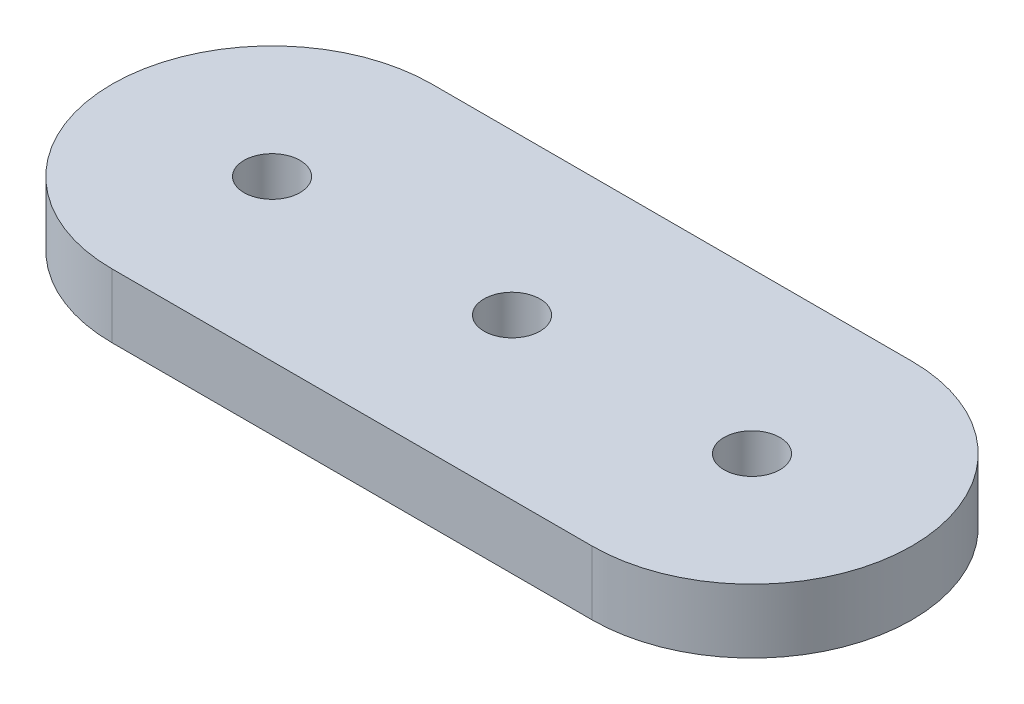
ISO-10303-21;
HEADER;
FILE_DESCRIPTION(('STEP AP214'),'2;1');
FILE_NAME('part.step','',(''),(''),'','','');
FILE_SCHEMA(('AUTOMOTIVE_DESIGN { 1 0 10303 214 1 1 1 1 }'));
ENDSEC;
DATA;
#1=APPLICATION_CONTEXT('core data for automotive mechanical design processes');
#2=APPLICATION_PROTOCOL_DEFINITION('international standard','automotive_design',2000,#1);
#3=PRODUCT_CONTEXT('',#1,'mechanical');
#4=PRODUCT('Part','Part','',(#3));
#5=PRODUCT_RELATED_PRODUCT_CATEGORY('part','',(#4));
#6=PRODUCT_DEFINITION_FORMATION('','',#4);
#7=PRODUCT_DEFINITION_CONTEXT('part definition',#1,'design');
#8=PRODUCT_DEFINITION('design','',#6,#7);
#9=PRODUCT_DEFINITION_SHAPE('','',#8);
#10=(LENGTH_UNIT() NAMED_UNIT(*) SI_UNIT(.MILLI.,.METRE.));
#11=(NAMED_UNIT(*) PLANE_ANGLE_UNIT() SI_UNIT($,.RADIAN.));
#12=(NAMED_UNIT(*) SI_UNIT($,.STERADIAN.) SOLID_ANGLE_UNIT());
#13=UNCERTAINTY_MEASURE_WITH_UNIT(LENGTH_MEASURE(1.E-05),#10,'distance_accuracy_value','');
#14=(GEOMETRIC_REPRESENTATION_CONTEXT(3) GLOBAL_UNCERTAINTY_ASSIGNED_CONTEXT((#13)) GLOBAL_UNIT_ASSIGNED_CONTEXT((#10,
#11,#12)) REPRESENTATION_CONTEXT('',''));
#15=CARTESIAN_POINT('',(0.,0.,0.));
#16=DIRECTION('',(0.,0.,1.));
#17=DIRECTION('',(1.,0.,0.));
#18=AXIS2_PLACEMENT_3D('',#15,#16,#17);
#19=CARTESIAN_POINT('',(0.,4.,0.));
#20=DIRECTION('',(0.,1.,0.));
#21=DIRECTION('',(0.,0.,1.));
#22=AXIS2_PLACEMENT_3D('',#19,#20,#21);
#23=PLANE('',#22);
#24=CARTESIAN_POINT('',(30.,4.,0.));
#25=DIRECTION('',(0.,1.,0.));
#26=DIRECTION('',(0.,0.,1.));
#27=AXIS2_PLACEMENT_3D('',#24,#25,#26);
#28=CIRCLE('',#27,1.75);
#29=CARTESIAN_POINT('',(30.,4.,1.75));
#30=VERTEX_POINT('',#29);
#31=EDGE_CURVE('E116',#30,#30,#28,.T.);
#32=ORIENTED_EDGE('',*,*,#31,.F.);
#33=EDGE_LOOP('',(#32));
#34=FACE_BOUND('',#33,.T.);
#35=CARTESIAN_POINT('',(0.,4.,0.));
#36=DIRECTION('',(0.,1.,0.));
#37=DIRECTION('',(0.,0.,1.));
#38=AXIS2_PLACEMENT_3D('',#35,#36,#37);
#39=CIRCLE('',#38,10.);
#40=CARTESIAN_POINT('',(0.,4.,-10.));
#41=VERTEX_POINT('',#40);
#42=CARTESIAN_POINT('',(0.,4.,10.));
#43=VERTEX_POINT('',#42);
#44=EDGE_CURVE('E86',#41,#43,#39,.T.);
#45=ORIENTED_EDGE('',*,*,#44,.T.);
#46=DIRECTION('',(1.,0.,0.));
#47=VECTOR('',#46,1.);
#48=CARTESIAN_POINT('',(0.,4.,10.));
#49=LINE('',#48,#47);
#50=CARTESIAN_POINT('',(30.,4.,10.));
#51=VERTEX_POINT('',#50);
#52=EDGE_CURVE('E81',#43,#51,#49,.T.);
#53=ORIENTED_EDGE('',*,*,#52,.T.);
#54=CARTESIAN_POINT('',(30.,4.,0.));
#55=DIRECTION('',(0.,1.,0.));
#56=DIRECTION('',(0.,0.,1.));
#57=AXIS2_PLACEMENT_3D('',#54,#55,#56);
#58=CIRCLE('',#57,10.);
#59=CARTESIAN_POINT('',(30.,4.,-10.));
#60=VERTEX_POINT('',#59);
#61=EDGE_CURVE('E84',#51,#60,#58,.T.);
#62=ORIENTED_EDGE('',*,*,#61,.T.);
#63=DIRECTION('',(-1.,0.,0.));
#64=VECTOR('',#63,1.);
#65=CARTESIAN_POINT('',(0.,4.,-10.));
#66=LINE('',#65,#64);
#67=EDGE_CURVE('E51',#60,#41,#66,.T.);
#68=ORIENTED_EDGE('',*,*,#67,.T.);
#69=EDGE_LOOP('',(#45,#53,#62,#68));
#70=FACE_BOUND('',#69,.T.);
#71=CARTESIAN_POINT('',(0.,4.,0.));
#72=DIRECTION('',(0.,1.,0.));
#73=DIRECTION('',(0.,0.,1.));
#74=AXIS2_PLACEMENT_3D('',#71,#72,#73);
#75=CIRCLE('',#74,1.75);
#76=CARTESIAN_POINT('',(0.,4.,1.75));
#77=VERTEX_POINT('',#76);
#78=EDGE_CURVE('E101',#77,#77,#75,.T.);
#79=ORIENTED_EDGE('',*,*,#78,.F.);
#80=EDGE_LOOP('',(#79));
#81=FACE_BOUND('',#80,.T.);
#82=CARTESIAN_POINT('',(15.,4.,0.));
#83=DIRECTION('',(0.,1.,0.));
#84=DIRECTION('',(0.,0.,1.));
#85=AXIS2_PLACEMENT_3D('',#82,#83,#84);
#86=CIRCLE('',#85,1.75);
#87=CARTESIAN_POINT('',(15.,4.,1.75));
#88=VERTEX_POINT('',#87);
#89=EDGE_CURVE('E122',#88,#88,#86,.T.);
#90=ORIENTED_EDGE('',*,*,#89,.F.);
#91=EDGE_LOOP('',(#90));
#92=FACE_BOUND('',#91,.T.);
#93=ADVANCED_FACE('F34',(#34,#70,#81,#92),#23,.T.);
#94=CARTESIAN_POINT('',(0.,0.,0.));
#95=DIRECTION('',(0.,1.,0.));
#96=DIRECTION('',(0.,0.,1.));
#97=AXIS2_PLACEMENT_3D('',#94,#95,#96);
#98=PLANE('',#97);
#99=CARTESIAN_POINT('',(0.,0.,0.));
#100=DIRECTION('',(0.,1.,0.));
#101=DIRECTION('',(0.,0.,1.));
#102=AXIS2_PLACEMENT_3D('',#99,#100,#101);
#103=CIRCLE('',#102,10.);
#104=CARTESIAN_POINT('',(0.,0.,-10.));
#105=VERTEX_POINT('',#104);
#106=CARTESIAN_POINT('',(0.,0.,10.));
#107=VERTEX_POINT('',#106);
#108=EDGE_CURVE('E98',#105,#107,#103,.T.);
#109=ORIENTED_EDGE('',*,*,#108,.F.);
#110=DIRECTION('',(-1.,0.,0.));
#111=VECTOR('',#110,1.);
#112=CARTESIAN_POINT('',(0.,0.,-10.));
#113=LINE('',#112,#111);
#114=CARTESIAN_POINT('',(30.,0.,-10.));
#115=VERTEX_POINT('',#114);
#116=EDGE_CURVE('E74',#115,#105,#113,.T.);
#117=ORIENTED_EDGE('',*,*,#116,.F.);
#118=CARTESIAN_POINT('',(30.,0.,0.));
#119=DIRECTION('',(0.,1.,0.));
#120=DIRECTION('',(0.,0.,1.));
#121=AXIS2_PLACEMENT_3D('',#118,#119,#120);
#122=CIRCLE('',#121,10.);
#123=CARTESIAN_POINT('',(30.,0.,10.));
#124=VERTEX_POINT('',#123);
#125=EDGE_CURVE('E68',#124,#115,#122,.T.);
#126=ORIENTED_EDGE('',*,*,#125,.F.);
#127=DIRECTION('',(1.,0.,0.));
#128=VECTOR('',#127,1.);
#129=CARTESIAN_POINT('',(0.,0.,10.));
#130=LINE('',#129,#128);
#131=EDGE_CURVE('E90',#107,#124,#130,.T.);
#132=ORIENTED_EDGE('',*,*,#131,.F.);
#133=EDGE_LOOP('',(#109,#117,#126,#132));
#134=FACE_BOUND('',#133,.T.);
#135=CARTESIAN_POINT('',(0.,0.,0.));
#136=DIRECTION('',(0.,1.,0.));
#137=DIRECTION('',(0.,0.,1.));
#138=AXIS2_PLACEMENT_3D('',#135,#136,#137);
#139=CIRCLE('',#138,1.75);
#140=CARTESIAN_POINT('',(0.,0.,1.75));
#141=VERTEX_POINT('',#140);
#142=EDGE_CURVE('E113',#141,#141,#139,.T.);
#143=ORIENTED_EDGE('',*,*,#142,.T.);
#144=EDGE_LOOP('',(#143));
#145=FACE_BOUND('',#144,.T.);
#146=CARTESIAN_POINT('',(30.,0.,0.));
#147=DIRECTION('',(0.,1.,0.));
#148=DIRECTION('',(0.,0.,1.));
#149=AXIS2_PLACEMENT_3D('',#146,#147,#148);
#150=CIRCLE('',#149,1.75);
#151=CARTESIAN_POINT('',(30.,0.,1.75));
#152=VERTEX_POINT('',#151);
#153=EDGE_CURVE('E119',#152,#152,#150,.T.);
#154=ORIENTED_EDGE('',*,*,#153,.T.);
#155=EDGE_LOOP('',(#154));
#156=FACE_BOUND('',#155,.T.);
#157=CARTESIAN_POINT('',(15.,0.,0.));
#158=DIRECTION('',(0.,1.,0.));
#159=DIRECTION('',(0.,0.,1.));
#160=AXIS2_PLACEMENT_3D('',#157,#158,#159);
#161=CIRCLE('',#160,1.75);
#162=CARTESIAN_POINT('',(15.,0.,1.75));
#163=VERTEX_POINT('',#162);
#164=EDGE_CURVE('E125',#163,#163,#161,.T.);
#165=ORIENTED_EDGE('',*,*,#164,.T.);
#166=EDGE_LOOP('',(#165));
#167=FACE_BOUND('',#166,.T.);
#168=ADVANCED_FACE('F109',(#134,#145,#156,#167),#98,.F.);
#169=CARTESIAN_POINT('',(0.,4.,0.));
#170=DIRECTION('',(0.,-1.,0.));
#171=DIRECTION('',(0.,0.,-1.));
#172=AXIS2_PLACEMENT_3D('',#169,#170,#171);
#173=CYLINDRICAL_SURFACE('',#172,10.);
#174=ORIENTED_EDGE('',*,*,#108,.T.);
#175=DIRECTION('',(0.,-1.,0.));
#176=VECTOR('',#175,1.);
#177=CARTESIAN_POINT('',(0.,4.,10.));
#178=LINE('',#177,#176);
#179=EDGE_CURVE('E11',#43,#107,#178,.T.);
#180=ORIENTED_EDGE('',*,*,#179,.F.);
#181=ORIENTED_EDGE('',*,*,#44,.F.);
#182=DIRECTION('',(0.,-1.,0.));
#183=VECTOR('',#182,1.);
#184=CARTESIAN_POINT('',(0.,4.,-10.));
#185=LINE('',#184,#183);
#186=EDGE_CURVE('E94',#41,#105,#185,.T.);
#187=ORIENTED_EDGE('',*,*,#186,.T.);
#188=EDGE_LOOP('',(#174,#180,#181,#187));
#189=FACE_BOUND('',#188,.T.);
#190=ADVANCED_FACE('F36',(#189),#173,.T.);
#191=CARTESIAN_POINT('',(0.,4.,10.));
#192=DIRECTION('',(0.,0.,-1.));
#193=DIRECTION('',(-1.,0.,0.));
#194=AXIS2_PLACEMENT_3D('',#191,#192,#193);
#195=PLANE('',#194);
#196=ORIENTED_EDGE('',*,*,#131,.T.);
#197=DIRECTION('',(0.,-1.,0.));
#198=VECTOR('',#197,1.);
#199=CARTESIAN_POINT('',(30.,4.,10.));
#200=LINE('',#199,#198);
#201=EDGE_CURVE('E43',#51,#124,#200,.T.);
#202=ORIENTED_EDGE('',*,*,#201,.F.);
#203=ORIENTED_EDGE('',*,*,#52,.F.);
#204=ORIENTED_EDGE('',*,*,#179,.T.);
#205=EDGE_LOOP('',(#196,#202,#203,#204));
#206=FACE_BOUND('',#205,.T.);
#207=ADVANCED_FACE('F89',(#206),#195,.F.);
#208=CARTESIAN_POINT('',(30.,4.,0.));
#209=DIRECTION('',(0.,-1.,0.));
#210=DIRECTION('',(0.,0.,-1.));
#211=AXIS2_PLACEMENT_3D('',#208,#209,#210);
#212=CYLINDRICAL_SURFACE('',#211,10.);
#213=ORIENTED_EDGE('',*,*,#125,.T.);
#214=DIRECTION('',(0.,-1.,0.));
#215=VECTOR('',#214,1.);
#216=CARTESIAN_POINT('',(30.,4.,-10.));
#217=LINE('',#216,#215);
#218=EDGE_CURVE('E91',#60,#115,#217,.T.);
#219=ORIENTED_EDGE('',*,*,#218,.F.);
#220=ORIENTED_EDGE('',*,*,#61,.F.);
#221=ORIENTED_EDGE('',*,*,#201,.T.);
#222=EDGE_LOOP('',(#213,#219,#220,#221));
#223=FACE_BOUND('',#222,.T.);
#224=ADVANCED_FACE('F92',(#223),#212,.T.);
#225=CARTESIAN_POINT('',(0.,4.,-10.));
#226=DIRECTION('',(0.,0.,1.));
#227=DIRECTION('',(1.,0.,0.));
#228=AXIS2_PLACEMENT_3D('',#225,#226,#227);
#229=PLANE('',#228);
#230=ORIENTED_EDGE('',*,*,#116,.T.);
#231=ORIENTED_EDGE('',*,*,#186,.F.);
#232=ORIENTED_EDGE('',*,*,#67,.F.);
#233=ORIENTED_EDGE('',*,*,#218,.T.);
#234=EDGE_LOOP('',(#230,#231,#232,#233));
#235=FACE_BOUND('',#234,.T.);
#236=ADVANCED_FACE('F106',(#235),#229,.F.);
#237=CARTESIAN_POINT('',(0.,4.,0.));
#238=DIRECTION('',(0.,-1.,0.));
#239=DIRECTION('',(0.,0.,-1.));
#240=AXIS2_PLACEMENT_3D('',#237,#238,#239);
#241=CYLINDRICAL_SURFACE('',#240,1.75);
#242=ORIENTED_EDGE('',*,*,#78,.T.);
#243=EDGE_LOOP('',(#242));
#244=FACE_BOUND('',#243,.T.);
#245=ORIENTED_EDGE('',*,*,#142,.F.);
#246=EDGE_LOOP('',(#245));
#247=FACE_BOUND('',#246,.T.);
#248=ADVANCED_FACE('F143',(#244,#247),#241,.F.);
#249=CARTESIAN_POINT('',(30.,4.,0.));
#250=DIRECTION('',(0.,-1.,0.));
#251=DIRECTION('',(0.,0.,-1.));
#252=AXIS2_PLACEMENT_3D('',#249,#250,#251);
#253=CYLINDRICAL_SURFACE('',#252,1.75);
#254=ORIENTED_EDGE('',*,*,#31,.T.);
#255=EDGE_LOOP('',(#254));
#256=FACE_BOUND('',#255,.T.);
#257=ORIENTED_EDGE('',*,*,#153,.F.);
#258=EDGE_LOOP('',(#257));
#259=FACE_BOUND('',#258,.T.);
#260=ADVANCED_FACE('F189',(#256,#259),#253,.F.);
#261=CARTESIAN_POINT('',(15.,4.,0.));
#262=DIRECTION('',(0.,-1.,0.));
#263=DIRECTION('',(0.,0.,-1.));
#264=AXIS2_PLACEMENT_3D('',#261,#262,#263);
#265=CYLINDRICAL_SURFACE('',#264,1.75);
#266=ORIENTED_EDGE('',*,*,#89,.T.);
#267=EDGE_LOOP('',(#266));
#268=FACE_BOUND('',#267,.T.);
#269=ORIENTED_EDGE('',*,*,#164,.F.);
#270=EDGE_LOOP('',(#269));
#271=FACE_BOUND('',#270,.T.);
#272=ADVANCED_FACE('F131',(#268,#271),#265,.F.);
#273=CLOSED_SHELL('',(#93,#168,#190,#207,#224,#236,#248,#260,#272));
#274=MANIFOLD_SOLID_BREP('B2',#273);
#275=ADVANCED_BREP_SHAPE_REPRESENTATION('',(#18,#274),#14);
#276=SHAPE_DEFINITION_REPRESENTATION(#9,#275);
ENDSEC;
END-ISO-10303-21;
